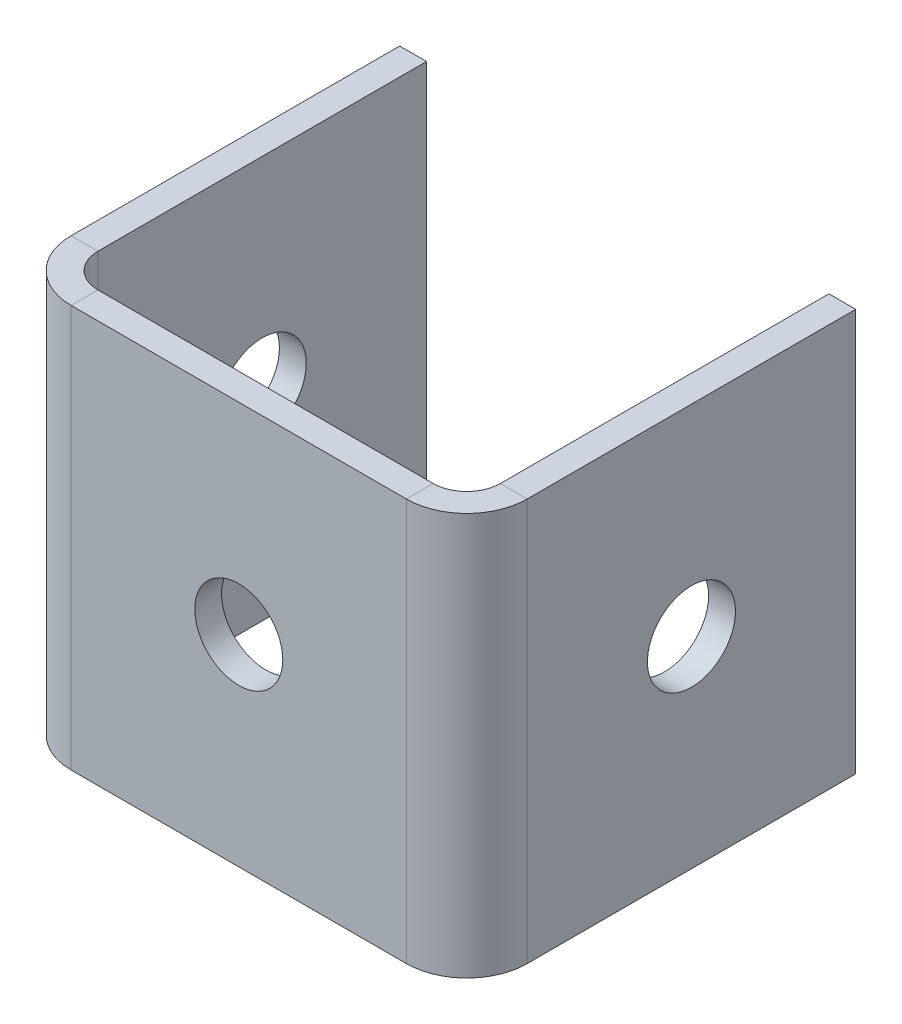
ISO-10303-21;
HEADER;
FILE_DESCRIPTION(('STEP AP214'),'2;1');
FILE_NAME('part.step','',(''),(''),'','','');
FILE_SCHEMA(('AUTOMOTIVE_DESIGN { 1 0 10303 214 1 1 1 1 }'));
ENDSEC;
DATA;
#1=APPLICATION_CONTEXT('core data for automotive mechanical design processes');
#2=APPLICATION_PROTOCOL_DEFINITION('international standard','automotive_design',2000,#1);
#3=PRODUCT_CONTEXT('',#1,'mechanical');
#4=PRODUCT('Part','Part','',(#3));
#5=PRODUCT_RELATED_PRODUCT_CATEGORY('part','',(#4));
#6=PRODUCT_DEFINITION_FORMATION('','',#4);
#7=PRODUCT_DEFINITION_CONTEXT('part definition',#1,'design');
#8=PRODUCT_DEFINITION('design','',#6,#7);
#9=PRODUCT_DEFINITION_SHAPE('','',#8);
#10=(LENGTH_UNIT() NAMED_UNIT(*) SI_UNIT(.MILLI.,.METRE.));
#11=(NAMED_UNIT(*) PLANE_ANGLE_UNIT() SI_UNIT($,.RADIAN.));
#12=(NAMED_UNIT(*) SI_UNIT($,.STERADIAN.) SOLID_ANGLE_UNIT());
#13=UNCERTAINTY_MEASURE_WITH_UNIT(LENGTH_MEASURE(1.E-05),#10,'distance_accuracy_value','');
#14=(GEOMETRIC_REPRESENTATION_CONTEXT(3) GLOBAL_UNCERTAINTY_ASSIGNED_CONTEXT((#13)) GLOBAL_UNIT_ASSIGNED_CONTEXT((#10,
#11,#12)) REPRESENTATION_CONTEXT('',''));
#15=CARTESIAN_POINT('',(0.,0.,0.));
#16=DIRECTION('',(0.,0.,1.));
#17=DIRECTION('',(1.,0.,0.));
#18=AXIS2_PLACEMENT_3D('',#15,#16,#17);
#19=CARTESIAN_POINT('',(-15.875,-19.05,-2.54));
#20=DIRECTION('',(0.,-1.,0.));
#21=DIRECTION('',(0.,0.,-1.));
#22=AXIS2_PLACEMENT_3D('',#19,#20,#21);
#23=PLANE('',#22);
#24=DIRECTION('',(1.,0.,0.));
#25=VECTOR('',#24,1.);
#26=CARTESIAN_POINT('',(-15.875,-19.05,0.));
#27=LINE('',#26,#25);
#28=CARTESIAN_POINT('',(-15.875,-19.05,0.));
#29=VERTEX_POINT('',#28);
#30=CARTESIAN_POINT('',(15.875,-19.05,0.));
#31=VERTEX_POINT('',#30);
#32=EDGE_CURVE('E269',#29,#31,#27,.T.);
#33=ORIENTED_EDGE('',*,*,#32,.F.);
#34=DIRECTION('',(0.,0.,1.));
#35=VECTOR('',#34,1.);
#36=CARTESIAN_POINT('',(-15.875,-19.05,-2.54));
#37=LINE('',#36,#35);
#38=CARTESIAN_POINT('',(-15.875,-19.05,-2.54000000000001));
#39=VERTEX_POINT('',#38);
#40=EDGE_CURVE('E90',#39,#29,#37,.T.);
#41=ORIENTED_EDGE('',*,*,#40,.F.);
#42=DIRECTION('',(1.,0.,0.));
#43=VECTOR('',#42,1.);
#44=CARTESIAN_POINT('',(-15.875,-19.05,-2.54));
#45=LINE('',#44,#43);
#46=CARTESIAN_POINT('',(15.875,-19.05,-2.54000000000001));
#47=VERTEX_POINT('',#46);
#48=EDGE_CURVE('E274',#39,#47,#45,.T.);
#49=ORIENTED_EDGE('',*,*,#48,.T.);
#50=DIRECTION('',(0.,0.,1.));
#51=VECTOR('',#50,1.);
#52=CARTESIAN_POINT('',(15.875,-19.05,-2.54));
#53=LINE('',#52,#51);
#54=EDGE_CURVE('E13',#47,#31,#53,.T.);
#55=ORIENTED_EDGE('',*,*,#54,.T.);
#56=EDGE_LOOP('',(#33,#41,#49,#55));
#57=FACE_BOUND('',#56,.T.);
#58=ADVANCED_FACE('F81',(#57),#23,.T.);
#59=CARTESIAN_POINT('',(-15.875,19.05,-2.54));
#60=DIRECTION('',(0.,1.,0.));
#61=DIRECTION('',(0.,0.,1.));
#62=AXIS2_PLACEMENT_3D('',#59,#60,#61);
#63=PLANE('',#62);
#64=DIRECTION('',(-1.,0.,0.));
#65=VECTOR('',#64,1.);
#66=CARTESIAN_POINT('',(-15.875,19.05,0.));
#67=LINE('',#66,#65);
#68=CARTESIAN_POINT('',(15.875,19.05,0.));
#69=VERTEX_POINT('',#68);
#70=CARTESIAN_POINT('',(-15.875,19.05,0.));
#71=VERTEX_POINT('',#70);
#72=EDGE_CURVE('E279',#69,#71,#67,.T.);
#73=ORIENTED_EDGE('',*,*,#72,.F.);
#74=DIRECTION('',(0.,0.,1.));
#75=VECTOR('',#74,1.);
#76=CARTESIAN_POINT('',(15.875,19.05,-2.54));
#77=LINE('',#76,#75);
#78=CARTESIAN_POINT('',(15.875,19.05,-2.54000000000001));
#79=VERTEX_POINT('',#78);
#80=EDGE_CURVE('E85',#79,#69,#77,.T.);
#81=ORIENTED_EDGE('',*,*,#80,.F.);
#82=DIRECTION('',(-1.,0.,0.));
#83=VECTOR('',#82,1.);
#84=CARTESIAN_POINT('',(-15.875,19.05,-2.54));
#85=LINE('',#84,#83);
#86=CARTESIAN_POINT('',(-15.875,19.05,-2.54000000000001));
#87=VERTEX_POINT('',#86);
#88=EDGE_CURVE('E268',#79,#87,#85,.T.);
#89=ORIENTED_EDGE('',*,*,#88,.T.);
#90=DIRECTION('',(0.,0.,1.));
#91=VECTOR('',#90,1.);
#92=CARTESIAN_POINT('',(-15.875,19.05,-2.54));
#93=LINE('',#92,#91);
#94=EDGE_CURVE('E287',#87,#71,#93,.T.);
#95=ORIENTED_EDGE('',*,*,#94,.T.);
#96=EDGE_LOOP('',(#73,#81,#89,#95));
#97=FACE_BOUND('',#96,.T.);
#98=ADVANCED_FACE('F83',(#97),#63,.T.);
#99=CARTESIAN_POINT('',(0.,0.,-2.54));
#100=DIRECTION('',(0.,0.,1.));
#101=DIRECTION('',(1.,0.,0.));
#102=AXIS2_PLACEMENT_3D('',#99,#100,#101);
#103=PLANE('',#102);
#104=CARTESIAN_POINT('',(0.,0.,-2.54));
#105=DIRECTION('',(0.,0.,1.));
#106=DIRECTION('',(1.,0.,0.));
#107=AXIS2_PLACEMENT_3D('',#104,#105,#106);
#108=CIRCLE('',#107,4.16725099999999);
#109=CARTESIAN_POINT('',(4.16725099999999,0.,-2.54));
#110=VERTEX_POINT('',#109);
#111=EDGE_CURVE('E214',#110,#110,#108,.T.);
#112=ORIENTED_EDGE('',*,*,#111,.T.);
#113=EDGE_LOOP('',(#112));
#114=FACE_BOUND('',#113,.T.);
#115=DIRECTION('',(0.,1.,0.));
#116=VECTOR('',#115,1.);
#117=CARTESIAN_POINT('',(15.875,19.05,-2.54));
#118=LINE('',#117,#116);
#119=EDGE_CURVE('E266',#47,#79,#118,.T.);
#120=ORIENTED_EDGE('',*,*,#119,.F.);
#121=ORIENTED_EDGE('',*,*,#48,.F.);
#122=DIRECTION('',(0.,-1.,0.));
#123=VECTOR('',#122,1.);
#124=CARTESIAN_POINT('',(-15.875,19.05,-2.54));
#125=LINE('',#124,#123);
#126=EDGE_CURVE('E272',#87,#39,#125,.T.);
#127=ORIENTED_EDGE('',*,*,#126,.F.);
#128=ORIENTED_EDGE('',*,*,#88,.F.);
#129=EDGE_LOOP('',(#120,#121,#127,#128));
#130=FACE_BOUND('',#129,.T.);
#131=ADVANCED_FACE('F311',(#114,#130),#103,.F.);
#132=CARTESIAN_POINT('',(0.,0.,0.));
#133=DIRECTION('',(0.,0.,1.));
#134=DIRECTION('',(1.,0.,0.));
#135=AXIS2_PLACEMENT_3D('',#132,#133,#134);
#136=PLANE('',#135);
#137=CARTESIAN_POINT('',(0.,0.,0.));
#138=DIRECTION('',(0.,0.,1.));
#139=DIRECTION('',(1.,0.,0.));
#140=AXIS2_PLACEMENT_3D('',#137,#138,#139);
#141=CIRCLE('',#140,4.167251);
#142=CARTESIAN_POINT('',(4.167251,0.,0.));
#143=VERTEX_POINT('',#142);
#144=EDGE_CURVE('E429',#143,#143,#141,.T.);
#145=ORIENTED_EDGE('',*,*,#144,.F.);
#146=EDGE_LOOP('',(#145));
#147=FACE_BOUND('',#146,.T.);
#148=DIRECTION('',(0.,1.,0.));
#149=VECTOR('',#148,1.);
#150=CARTESIAN_POINT('',(15.875,19.05,0.));
#151=LINE('',#150,#149);
#152=EDGE_CURVE('E257',#31,#69,#151,.T.);
#153=ORIENTED_EDGE('',*,*,#152,.T.);
#154=ORIENTED_EDGE('',*,*,#72,.T.);
#155=DIRECTION('',(0.,-1.,0.));
#156=VECTOR('',#155,1.);
#157=CARTESIAN_POINT('',(-15.875,19.05,0.));
#158=LINE('',#157,#156);
#159=EDGE_CURVE('E282',#71,#29,#158,.T.);
#160=ORIENTED_EDGE('',*,*,#159,.T.);
#161=ORIENTED_EDGE('',*,*,#32,.T.);
#162=EDGE_LOOP('',(#153,#154,#160,#161));
#163=FACE_BOUND('',#162,.T.);
#164=ADVANCED_FACE('F297',(#147,#163),#136,.T.);
#165=CARTESIAN_POINT('',(15.875,19.05,-5.715));
#166=DIRECTION('',(0.,1.,0.));
#167=DIRECTION('',(0.,0.,1.));
#168=AXIS2_PLACEMENT_3D('',#165,#166,#167);
#169=PLANE('',#168);
#170=DIRECTION('',(-1.,0.,0.));
#171=VECTOR('',#170,1.);
#172=CARTESIAN_POINT('',(21.59,19.05,-5.71499999999998));
#173=LINE('',#172,#171);
#174=CARTESIAN_POINT('',(19.05,19.05,-5.71499999999999));
#175=VERTEX_POINT('',#174);
#176=CARTESIAN_POINT('',(21.59,19.05,-5.71499999999998));
#177=VERTEX_POINT('',#176);
#178=EDGE_CURVE('E216',#175,#177,#173,.F.);
#179=ORIENTED_EDGE('',*,*,#178,.F.);
#180=CARTESIAN_POINT('',(15.875,19.05,-5.715));
#181=DIRECTION('',(0.,-1.,0.));
#182=DIRECTION('',(0.,0.,-1.));
#183=AXIS2_PLACEMENT_3D('',#180,#181,#182);
#184=CIRCLE('',#183,3.17499999999999);
#185=EDGE_CURVE('E261',#79,#175,#184,.F.);
#186=ORIENTED_EDGE('',*,*,#185,.F.);
#187=ORIENTED_EDGE('',*,*,#80,.T.);
#188=CARTESIAN_POINT('',(15.875,19.05,-5.715));
#189=DIRECTION('',(0.,-1.,0.));
#190=DIRECTION('',(0.,0.,-1.));
#191=AXIS2_PLACEMENT_3D('',#188,#189,#190);
#192=CIRCLE('',#191,5.71499999999999);
#193=EDGE_CURVE('E106',#69,#177,#192,.F.);
#194=ORIENTED_EDGE('',*,*,#193,.T.);
#195=EDGE_LOOP('',(#179,#186,#187,#194));
#196=FACE_BOUND('',#195,.T.);
#197=ADVANCED_FACE('F294',(#196),#169,.T.);
#198=CARTESIAN_POINT('',(15.875,-19.05,-5.715));
#199=DIRECTION('',(0.,1.,0.));
#200=DIRECTION('',(0.,0.,1.));
#201=AXIS2_PLACEMENT_3D('',#198,#199,#200);
#202=PLANE('',#201);
#203=CARTESIAN_POINT('',(15.875,-19.05,-5.715));
#204=DIRECTION('',(0.,-1.,0.));
#205=DIRECTION('',(0.,0.,-1.));
#206=AXIS2_PLACEMENT_3D('',#203,#204,#205);
#207=CIRCLE('',#206,3.17499999999999);
#208=CARTESIAN_POINT('',(19.05,-19.05,-5.71499999999999));
#209=VERTEX_POINT('',#208);
#210=EDGE_CURVE('E229',#209,#47,#207,.T.);
#211=ORIENTED_EDGE('',*,*,#210,.F.);
#212=DIRECTION('',(-1.,0.,0.));
#213=VECTOR('',#212,1.);
#214=CARTESIAN_POINT('',(19.05,-19.05,-5.71499999999999));
#215=LINE('',#214,#213);
#216=CARTESIAN_POINT('',(21.59,-19.05,-5.71499999999998));
#217=VERTEX_POINT('',#216);
#218=EDGE_CURVE('E249',#209,#217,#215,.F.);
#219=ORIENTED_EDGE('',*,*,#218,.T.);
#220=CARTESIAN_POINT('',(15.875,-19.05,-5.715));
#221=DIRECTION('',(0.,-1.,0.));
#222=DIRECTION('',(0.,0.,-1.));
#223=AXIS2_PLACEMENT_3D('',#220,#221,#222);
#224=CIRCLE('',#223,5.71499999999999);
#225=EDGE_CURVE('E258',#217,#31,#224,.T.);
#226=ORIENTED_EDGE('',*,*,#225,.T.);
#227=ORIENTED_EDGE('',*,*,#54,.F.);
#228=EDGE_LOOP('',(#211,#219,#226,#227));
#229=FACE_BOUND('',#228,.T.);
#230=ADVANCED_FACE('F302',(#229),#202,.F.);
#231=CARTESIAN_POINT('',(15.875,-19.05,-5.715));
#232=DIRECTION('',(0.,-1.,0.));
#233=DIRECTION('',(1.,0.,0.));
#234=AXIS2_PLACEMENT_3D('',#231,#232,#233);
#235=CYLINDRICAL_SURFACE('',#234,5.71499999999999);
#236=ORIENTED_EDGE('',*,*,#152,.F.);
#237=ORIENTED_EDGE('',*,*,#225,.F.);
#238=DIRECTION('',(0.,-1.,0.));
#239=VECTOR('',#238,1.);
#240=CARTESIAN_POINT('',(21.59,19.05,-5.71499999999998));
#241=LINE('',#240,#239);
#242=EDGE_CURVE('E247',#217,#177,#241,.F.);
#243=ORIENTED_EDGE('',*,*,#242,.T.);
#244=ORIENTED_EDGE('',*,*,#193,.F.);
#245=EDGE_LOOP('',(#236,#237,#243,#244));
#246=FACE_BOUND('',#245,.T.);
#247=ADVANCED_FACE('F299',(#246),#235,.T.);
#248=CARTESIAN_POINT('',(15.875,-19.05,-5.715));
#249=DIRECTION('',(0.,-1.,0.));
#250=DIRECTION('',(1.,0.,0.));
#251=AXIS2_PLACEMENT_3D('',#248,#249,#250);
#252=CYLINDRICAL_SURFACE('',#251,3.17499999999999);
#253=ORIENTED_EDGE('',*,*,#119,.T.);
#254=ORIENTED_EDGE('',*,*,#185,.T.);
#255=DIRECTION('',(0.,-1.,0.));
#256=VECTOR('',#255,1.);
#257=CARTESIAN_POINT('',(19.05,19.05,-5.71499999999999));
#258=LINE('',#257,#256);
#259=EDGE_CURVE('E252',#175,#209,#258,.T.);
#260=ORIENTED_EDGE('',*,*,#259,.T.);
#261=ORIENTED_EDGE('',*,*,#210,.T.);
#262=EDGE_LOOP('',(#253,#254,#260,#261));
#263=FACE_BOUND('',#262,.T.);
#264=ADVANCED_FACE('F313',(#263),#252,.F.);
#265=CARTESIAN_POINT('',(21.5900000000001,-19.05,-36.83));
#266=DIRECTION('',(0.,1.,0.));
#267=DIRECTION('',(-1.,0.,0.));
#268=AXIS2_PLACEMENT_3D('',#265,#266,#267);
#269=PLANE('',#268);
#270=ORIENTED_EDGE('',*,*,#218,.F.);
#271=DIRECTION('',(0.,0.,1.));
#272=VECTOR('',#271,1.);
#273=CARTESIAN_POINT('',(19.0500000000001,-19.05,-36.83));
#274=LINE('',#273,#272);
#275=CARTESIAN_POINT('',(19.0500000000001,-19.05,-36.83));
#276=VERTEX_POINT('',#275);
#277=EDGE_CURVE('E245',#209,#276,#274,.F.);
#278=ORIENTED_EDGE('',*,*,#277,.T.);
#279=DIRECTION('',(-1.,0.,0.));
#280=VECTOR('',#279,1.);
#281=CARTESIAN_POINT('',(21.5900000000001,-19.05,-36.83));
#282=LINE('',#281,#280);
#283=CARTESIAN_POINT('',(21.5900000000001,-19.05,-36.83));
#284=VERTEX_POINT('',#283);
#285=EDGE_CURVE('E226',#284,#276,#282,.T.);
#286=ORIENTED_EDGE('',*,*,#285,.F.);
#287=DIRECTION('',(0.,0.,-1.));
#288=VECTOR('',#287,1.);
#289=CARTESIAN_POINT('',(21.59,-19.05,0.));
#290=LINE('',#289,#288);
#291=EDGE_CURVE('E238',#217,#284,#290,.T.);
#292=ORIENTED_EDGE('',*,*,#291,.F.);
#293=EDGE_LOOP('',(#270,#278,#286,#292));
#294=FACE_BOUND('',#293,.T.);
#295=ADVANCED_FACE('F318',(#294),#269,.F.);
#296=CARTESIAN_POINT('',(21.59,19.05,-2.53999999999999));
#297=DIRECTION('',(0.,-1.,0.));
#298=DIRECTION('',(1.,0.,0.));
#299=AXIS2_PLACEMENT_3D('',#296,#297,#298);
#300=PLANE('',#299);
#301=ORIENTED_EDGE('',*,*,#178,.T.);
#302=DIRECTION('',(0.,0.,1.));
#303=VECTOR('',#302,1.);
#304=CARTESIAN_POINT('',(21.59,19.05,0.));
#305=LINE('',#304,#303);
#306=CARTESIAN_POINT('',(21.5900000000001,19.05,-36.83));
#307=VERTEX_POINT('',#306);
#308=EDGE_CURVE('E233',#307,#177,#305,.T.);
#309=ORIENTED_EDGE('',*,*,#308,.F.);
#310=DIRECTION('',(-1.,0.,0.));
#311=VECTOR('',#310,1.);
#312=CARTESIAN_POINT('',(21.5900000000001,19.05,-36.83));
#313=LINE('',#312,#311);
#314=CARTESIAN_POINT('',(19.0500000000001,19.05,-36.83));
#315=VERTEX_POINT('',#314);
#316=EDGE_CURVE('E230',#307,#315,#313,.T.);
#317=ORIENTED_EDGE('',*,*,#316,.T.);
#318=DIRECTION('',(0.,0.,-1.));
#319=VECTOR('',#318,1.);
#320=CARTESIAN_POINT('',(19.05,19.05,-2.54));
#321=LINE('',#320,#319);
#322=EDGE_CURVE('E240',#315,#175,#321,.F.);
#323=ORIENTED_EDGE('',*,*,#322,.T.);
#324=EDGE_LOOP('',(#301,#309,#317,#323));
#325=FACE_BOUND('',#324,.T.);
#326=ADVANCED_FACE('F330',(#325),#300,.F.);
#327=CARTESIAN_POINT('',(21.59,0.,0.));
#328=DIRECTION('',(-1.,0.,0.));
#329=DIRECTION('',(0.,0.,1.));
#330=AXIS2_PLACEMENT_3D('',#327,#328,#329);
#331=PLANE('',#330);
#332=CARTESIAN_POINT('',(21.5900000000001,0.,-21.2725));
#333=DIRECTION('',(1.,0.,0.));
#334=DIRECTION('',(0.,0.,-1.));
#335=AXIS2_PLACEMENT_3D('',#332,#333,#334);
#336=CIRCLE('',#335,4.16725099999999);
#337=CARTESIAN_POINT('',(21.5900000000001,0.,-25.439751));
#338=VERTEX_POINT('',#337);
#339=EDGE_CURVE('E420',#338,#338,#336,.T.);
#340=ORIENTED_EDGE('',*,*,#339,.F.);
#341=EDGE_LOOP('',(#340));
#342=FACE_BOUND('',#341,.T.);
#343=ORIENTED_EDGE('',*,*,#242,.F.);
#344=ORIENTED_EDGE('',*,*,#291,.T.);
#345=DIRECTION('',(0.,1.,0.));
#346=VECTOR('',#345,1.);
#347=CARTESIAN_POINT('',(21.5900000000001,0.,-36.83));
#348=LINE('',#347,#346);
#349=EDGE_CURVE('E236',#284,#307,#348,.T.);
#350=ORIENTED_EDGE('',*,*,#349,.T.);
#351=ORIENTED_EDGE('',*,*,#308,.T.);
#352=EDGE_LOOP('',(#343,#344,#350,#351));
#353=FACE_BOUND('',#352,.T.);
#354=ADVANCED_FACE('F332',(#342,#353),#331,.F.);
#355=CARTESIAN_POINT('',(19.05,0.,0.));
#356=DIRECTION('',(-1.,0.,0.));
#357=DIRECTION('',(0.,0.,1.));
#358=AXIS2_PLACEMENT_3D('',#355,#356,#357);
#359=PLANE('',#358);
#360=CARTESIAN_POINT('',(19.0500000000001,0.,-21.2725));
#361=DIRECTION('',(-1.,0.,0.));
#362=DIRECTION('',(0.,0.,1.));
#363=AXIS2_PLACEMENT_3D('',#360,#361,#362);
#364=CIRCLE('',#363,4.16725099999999);
#365=CARTESIAN_POINT('',(19.05,0.,-17.105249));
#366=VERTEX_POINT('',#365);
#367=EDGE_CURVE('E422',#366,#366,#364,.T.);
#368=ORIENTED_EDGE('',*,*,#367,.F.);
#369=EDGE_LOOP('',(#368));
#370=FACE_BOUND('',#369,.T.);
#371=ORIENTED_EDGE('',*,*,#277,.F.);
#372=ORIENTED_EDGE('',*,*,#259,.F.);
#373=ORIENTED_EDGE('',*,*,#322,.F.);
#374=DIRECTION('',(0.,-1.,0.));
#375=VECTOR('',#374,1.);
#376=CARTESIAN_POINT('',(19.0500000000001,19.05,-36.83));
#377=LINE('',#376,#375);
#378=EDGE_CURVE('E243',#276,#315,#377,.F.);
#379=ORIENTED_EDGE('',*,*,#378,.F.);
#380=EDGE_LOOP('',(#371,#372,#373,#379));
#381=FACE_BOUND('',#380,.T.);
#382=ADVANCED_FACE('F322',(#370,#381),#359,.T.);
#383=CARTESIAN_POINT('',(21.5900000000001,19.05,-36.83));
#384=DIRECTION('',(0.,0.,1.));
#385=DIRECTION('',(1.,0.,0.));
#386=AXIS2_PLACEMENT_3D('',#383,#384,#385);
#387=PLANE('',#386);
#388=ORIENTED_EDGE('',*,*,#378,.T.);
#389=ORIENTED_EDGE('',*,*,#316,.F.);
#390=ORIENTED_EDGE('',*,*,#349,.F.);
#391=ORIENTED_EDGE('',*,*,#285,.T.);
#392=EDGE_LOOP('',(#388,#389,#390,#391));
#393=FACE_BOUND('',#392,.T.);
#394=ADVANCED_FACE('F326',(#393),#387,.F.);
#395=CARTESIAN_POINT('',(-15.875,-19.05,-5.715));
#396=DIRECTION('',(0.,-1.,0.));
#397=DIRECTION('',(0.,0.,-1.));
#398=AXIS2_PLACEMENT_3D('',#395,#396,#397);
#399=PLANE('',#398);
#400=DIRECTION('',(1.,0.,0.));
#401=VECTOR('',#400,1.);
#402=CARTESIAN_POINT('',(-21.59,-19.05,-5.71499999999998));
#403=LINE('',#402,#401);
#404=CARTESIAN_POINT('',(-19.05,-19.05,-5.71499999999999));
#405=VERTEX_POINT('',#404);
#406=CARTESIAN_POINT('',(-21.59,-19.05,-5.71499999999998));
#407=VERTEX_POINT('',#406);
#408=EDGE_CURVE('E196',#405,#407,#403,.F.);
#409=ORIENTED_EDGE('',*,*,#408,.F.);
#410=CARTESIAN_POINT('',(-15.875,-19.05,-5.715));
#411=DIRECTION('',(0.,1.,0.));
#412=DIRECTION('',(0.,0.,1.));
#413=AXIS2_PLACEMENT_3D('',#410,#411,#412);
#414=CIRCLE('',#413,3.17499999999999);
#415=EDGE_CURVE('E220',#39,#405,#414,.F.);
#416=ORIENTED_EDGE('',*,*,#415,.F.);
#417=ORIENTED_EDGE('',*,*,#40,.T.);
#418=CARTESIAN_POINT('',(-15.875,-19.05,-5.715));
#419=DIRECTION('',(0.,1.,0.));
#420=DIRECTION('',(0.,0.,1.));
#421=AXIS2_PLACEMENT_3D('',#418,#419,#420);
#422=CIRCLE('',#421,5.71499999999999);
#423=EDGE_CURVE('E98',#29,#407,#422,.F.);
#424=ORIENTED_EDGE('',*,*,#423,.T.);
#425=EDGE_LOOP('',(#409,#416,#417,#424));
#426=FACE_BOUND('',#425,.T.);
#427=ADVANCED_FACE('F367',(#426),#399,.T.);
#428=CARTESIAN_POINT('',(-15.875,19.05,-5.715));
#429=DIRECTION('',(0.,-1.,0.));
#430=DIRECTION('',(0.,0.,-1.));
#431=AXIS2_PLACEMENT_3D('',#428,#429,#430);
#432=PLANE('',#431);
#433=CARTESIAN_POINT('',(-15.875,19.05,-5.715));
#434=DIRECTION('',(0.,1.,0.));
#435=DIRECTION('',(0.,0.,1.));
#436=AXIS2_PLACEMENT_3D('',#433,#434,#435);
#437=CIRCLE('',#436,3.17499999999999);
#438=CARTESIAN_POINT('',(-19.05,19.05,-5.71499999999999));
#439=VERTEX_POINT('',#438);
#440=EDGE_CURVE('E223',#439,#87,#437,.T.);
#441=ORIENTED_EDGE('',*,*,#440,.F.);
#442=DIRECTION('',(1.,0.,0.));
#443=VECTOR('',#442,1.);
#444=CARTESIAN_POINT('',(-19.05,19.05,-5.71499999999999));
#445=LINE('',#444,#443);
#446=CARTESIAN_POINT('',(-21.59,19.05,-5.71499999999998));
#447=VERTEX_POINT('',#446);
#448=EDGE_CURVE('E208',#439,#447,#445,.F.);
#449=ORIENTED_EDGE('',*,*,#448,.T.);
#450=CARTESIAN_POINT('',(-15.875,19.05,-5.715));
#451=DIRECTION('',(0.,1.,0.));
#452=DIRECTION('',(0.,0.,1.));
#453=AXIS2_PLACEMENT_3D('',#450,#451,#452);
#454=CIRCLE('',#453,5.71499999999999);
#455=EDGE_CURVE('E217',#447,#71,#454,.T.);
#456=ORIENTED_EDGE('',*,*,#455,.T.);
#457=ORIENTED_EDGE('',*,*,#94,.F.);
#458=EDGE_LOOP('',(#441,#449,#456,#457));
#459=FACE_BOUND('',#458,.T.);
#460=ADVANCED_FACE('F371',(#459),#432,.F.);
#461=CARTESIAN_POINT('',(-15.875,19.05,-5.715));
#462=DIRECTION('',(0.,1.,0.));
#463=DIRECTION('',(-1.,0.,0.));
#464=AXIS2_PLACEMENT_3D('',#461,#462,#463);
#465=CYLINDRICAL_SURFACE('',#464,5.71499999999999);
#466=ORIENTED_EDGE('',*,*,#159,.F.);
#467=ORIENTED_EDGE('',*,*,#455,.F.);
#468=DIRECTION('',(0.,1.,0.));
#469=VECTOR('',#468,1.);
#470=CARTESIAN_POINT('',(-21.59,-19.05,-5.71499999999998));
#471=LINE('',#470,#469);
#472=EDGE_CURVE('E206',#447,#407,#471,.F.);
#473=ORIENTED_EDGE('',*,*,#472,.T.);
#474=ORIENTED_EDGE('',*,*,#423,.F.);
#475=EDGE_LOOP('',(#466,#467,#473,#474));
#476=FACE_BOUND('',#475,.T.);
#477=ADVANCED_FACE('F377',(#476),#465,.T.);
#478=CARTESIAN_POINT('',(-15.875,19.05,-5.715));
#479=DIRECTION('',(0.,1.,0.));
#480=DIRECTION('',(-1.,0.,0.));
#481=AXIS2_PLACEMENT_3D('',#478,#479,#480);
#482=CYLINDRICAL_SURFACE('',#481,3.17499999999999);
#483=ORIENTED_EDGE('',*,*,#126,.T.);
#484=ORIENTED_EDGE('',*,*,#415,.T.);
#485=DIRECTION('',(0.,1.,0.));
#486=VECTOR('',#485,1.);
#487=CARTESIAN_POINT('',(-19.05,-19.05,-5.71499999999999));
#488=LINE('',#487,#486);
#489=EDGE_CURVE('E211',#405,#439,#488,.T.);
#490=ORIENTED_EDGE('',*,*,#489,.T.);
#491=ORIENTED_EDGE('',*,*,#440,.T.);
#492=EDGE_LOOP('',(#483,#484,#490,#491));
#493=FACE_BOUND('',#492,.T.);
#494=ADVANCED_FACE('F380',(#493),#482,.F.);
#495=CARTESIAN_POINT('',(-21.5900000000001,19.05,-36.83));
#496=DIRECTION('',(0.,-1.,0.));
#497=DIRECTION('',(0.,0.,-1.));
#498=AXIS2_PLACEMENT_3D('',#495,#496,#497);
#499=PLANE('',#498);
#500=ORIENTED_EDGE('',*,*,#448,.F.);
#501=DIRECTION('',(0.,0.,1.));
#502=VECTOR('',#501,1.);
#503=CARTESIAN_POINT('',(-19.0500000000001,19.05,-36.83));
#504=LINE('',#503,#502);
#505=CARTESIAN_POINT('',(-19.0500000000001,19.05,-36.83));
#506=VERTEX_POINT('',#505);
#507=EDGE_CURVE('E204',#439,#506,#504,.F.);
#508=ORIENTED_EDGE('',*,*,#507,.T.);
#509=DIRECTION('',(1.,0.,0.));
#510=VECTOR('',#509,1.);
#511=CARTESIAN_POINT('',(-21.5900000000001,19.05,-36.83));
#512=LINE('',#511,#510);
#513=CARTESIAN_POINT('',(-21.5900000000001,19.05,-36.83));
#514=VERTEX_POINT('',#513);
#515=EDGE_CURVE('E192',#514,#506,#512,.T.);
#516=ORIENTED_EDGE('',*,*,#515,.F.);
#517=DIRECTION('',(0.,0.,-1.));
#518=VECTOR('',#517,1.);
#519=CARTESIAN_POINT('',(-21.59,19.05,0.));
#520=LINE('',#519,#518);
#521=EDGE_CURVE('E179',#447,#514,#520,.T.);
#522=ORIENTED_EDGE('',*,*,#521,.F.);
#523=EDGE_LOOP('',(#500,#508,#516,#522));
#524=FACE_BOUND('',#523,.T.);
#525=ADVANCED_FACE('F383',(#524),#499,.F.);
#526=CARTESIAN_POINT('',(-21.59,-19.05,-2.53999999999999));
#527=DIRECTION('',(0.,1.,0.));
#528=DIRECTION('',(0.,0.,1.));
#529=AXIS2_PLACEMENT_3D('',#526,#527,#528);
#530=PLANE('',#529);
#531=ORIENTED_EDGE('',*,*,#408,.T.);
#532=DIRECTION('',(0.,0.,1.));
#533=VECTOR('',#532,1.);
#534=CARTESIAN_POINT('',(-21.59,-19.05,0.));
#535=LINE('',#534,#533);
#536=CARTESIAN_POINT('',(-21.5900000000001,-19.05,-36.83));
#537=VERTEX_POINT('',#536);
#538=EDGE_CURVE('E177',#537,#407,#535,.T.);
#539=ORIENTED_EDGE('',*,*,#538,.F.);
#540=DIRECTION('',(1.,0.,0.));
#541=VECTOR('',#540,1.);
#542=CARTESIAN_POINT('',(-21.5900000000001,-19.05,-36.83));
#543=LINE('',#542,#541);
#544=CARTESIAN_POINT('',(-19.0500000000001,-19.05,-36.83));
#545=VERTEX_POINT('',#544);
#546=EDGE_CURVE('E185',#537,#545,#543,.T.);
#547=ORIENTED_EDGE('',*,*,#546,.T.);
#548=DIRECTION('',(0.,0.,-1.));
#549=VECTOR('',#548,1.);
#550=CARTESIAN_POINT('',(-19.05,-19.05,-2.54));
#551=LINE('',#550,#549);
#552=EDGE_CURVE('E201',#545,#405,#551,.F.);
#553=ORIENTED_EDGE('',*,*,#552,.T.);
#554=EDGE_LOOP('',(#531,#539,#547,#553));
#555=FACE_BOUND('',#554,.T.);
#556=ADVANCED_FACE('F195',(#555),#530,.F.);
#557=CARTESIAN_POINT('',(-21.59,0.,0.));
#558=DIRECTION('',(1.,0.,0.));
#559=DIRECTION('',(0.,0.,-1.));
#560=AXIS2_PLACEMENT_3D('',#557,#558,#559);
#561=PLANE('',#560);
#562=CARTESIAN_POINT('',(-21.5900000000002,0.,-21.2725000000001));
#563=DIRECTION('',(1.,0.,0.));
#564=DIRECTION('',(0.,0.,-1.));
#565=AXIS2_PLACEMENT_3D('',#562,#563,#564);
#566=CIRCLE('',#565,4.16725099999999);
#567=CARTESIAN_POINT('',(-21.5900000000002,0.,-25.4397510000001));
#568=VERTEX_POINT('',#567);
#569=EDGE_CURVE('E419',#568,#568,#566,.T.);
#570=ORIENTED_EDGE('',*,*,#569,.T.);
#571=EDGE_LOOP('',(#570));
#572=FACE_BOUND('',#571,.T.);
#573=ORIENTED_EDGE('',*,*,#472,.F.);
#574=ORIENTED_EDGE('',*,*,#521,.T.);
#575=DIRECTION('',(0.,-1.,0.));
#576=VECTOR('',#575,1.);
#577=CARTESIAN_POINT('',(-21.5900000000001,0.,-36.83));
#578=LINE('',#577,#576);
#579=EDGE_CURVE('E172',#514,#537,#578,.T.);
#580=ORIENTED_EDGE('',*,*,#579,.T.);
#581=ORIENTED_EDGE('',*,*,#538,.T.);
#582=EDGE_LOOP('',(#573,#574,#580,#581));
#583=FACE_BOUND('',#582,.T.);
#584=ADVANCED_FACE('F175',(#572,#583),#561,.F.);
#585=CARTESIAN_POINT('',(-19.05,0.,0.));
#586=DIRECTION('',(1.,0.,0.));
#587=DIRECTION('',(0.,0.,-1.));
#588=AXIS2_PLACEMENT_3D('',#585,#586,#587);
#589=PLANE('',#588);
#590=CARTESIAN_POINT('',(-19.0500000000001,0.,-21.2725000000001));
#591=DIRECTION('',(1.,0.,0.));
#592=DIRECTION('',(0.,0.,-1.));
#593=AXIS2_PLACEMENT_3D('',#590,#591,#592);
#594=CIRCLE('',#593,4.16725099999999);
#595=CARTESIAN_POINT('',(-19.0500000000001,0.,-25.4397510000001));
#596=VERTEX_POINT('',#595);
#597=EDGE_CURVE('E416',#596,#596,#594,.T.);
#598=ORIENTED_EDGE('',*,*,#597,.F.);
#599=EDGE_LOOP('',(#598));
#600=FACE_BOUND('',#599,.T.);
#601=ORIENTED_EDGE('',*,*,#507,.F.);
#602=ORIENTED_EDGE('',*,*,#489,.F.);
#603=ORIENTED_EDGE('',*,*,#552,.F.);
#604=DIRECTION('',(0.,1.,0.));
#605=VECTOR('',#604,1.);
#606=CARTESIAN_POINT('',(-19.0500000000001,-19.05,-36.83));
#607=LINE('',#606,#605);
#608=EDGE_CURVE('E188',#506,#545,#607,.F.);
#609=ORIENTED_EDGE('',*,*,#608,.F.);
#610=EDGE_LOOP('',(#601,#602,#603,#609));
#611=FACE_BOUND('',#610,.T.);
#612=ADVANCED_FACE('F393',(#600,#611),#589,.T.);
#613=CARTESIAN_POINT('',(-21.5900000000001,-19.05,-36.83));
#614=DIRECTION('',(0.,0.,1.));
#615=DIRECTION('',(1.,0.,0.));
#616=AXIS2_PLACEMENT_3D('',#613,#614,#615);
#617=PLANE('',#616);
#618=ORIENTED_EDGE('',*,*,#608,.T.);
#619=ORIENTED_EDGE('',*,*,#546,.F.);
#620=ORIENTED_EDGE('',*,*,#579,.F.);
#621=ORIENTED_EDGE('',*,*,#515,.T.);
#622=EDGE_LOOP('',(#618,#619,#620,#621));
#623=FACE_BOUND('',#622,.T.);
#624=ADVANCED_FACE('F186',(#623),#617,.F.);
#625=CARTESIAN_POINT('',(0.,0.,0.));
#626=DIRECTION('',(0.,0.,1.));
#627=DIRECTION('',(1.,0.,0.));
#628=AXIS2_PLACEMENT_3D('',#625,#626,#627);
#629=CYLINDRICAL_SURFACE('',#628,4.16725099999999);
#630=ORIENTED_EDGE('',*,*,#144,.T.);
#631=EDGE_LOOP('',(#630));
#632=FACE_BOUND('',#631,.T.);
#633=ORIENTED_EDGE('',*,*,#111,.F.);
#634=EDGE_LOOP('',(#633));
#635=FACE_BOUND('',#634,.T.);
#636=ADVANCED_FACE('F392',(#632,#635),#629,.F.);
#637=CARTESIAN_POINT('',(21.5900000000001,0.,-21.2725));
#638=DIRECTION('',(1.,0.,0.));
#639=DIRECTION('',(0.,0.,-1.));
#640=AXIS2_PLACEMENT_3D('',#637,#638,#639);
#641=CYLINDRICAL_SURFACE('',#640,4.16725099999999);
#642=ORIENTED_EDGE('',*,*,#597,.T.);
#643=EDGE_LOOP('',(#642));
#644=FACE_BOUND('',#643,.T.);
#645=ORIENTED_EDGE('',*,*,#569,.F.);
#646=EDGE_LOOP('',(#645));
#647=FACE_BOUND('',#646,.T.);
#648=ADVANCED_FACE('F404',(#644,#647),#641,.F.);
#649=ORIENTED_EDGE('',*,*,#367,.T.);
#650=EDGE_LOOP('',(#649));
#651=FACE_BOUND('',#650,.T.);
#652=ORIENTED_EDGE('',*,*,#339,.T.);
#653=EDGE_LOOP('',(#652));
#654=FACE_BOUND('',#653,.T.);
#655=ADVANCED_FACE('F407',(#651,#654),#641,.F.);
#656=CLOSED_SHELL('',(#58,#98,#131,#164,#197,#230,#247,#264,#295,#326,#354,#382,#394,#427,#460,
#477,#494,#525,#556,#584,#612,#624,#636,#648,#655));
#657=MANIFOLD_SOLID_BREP('B2',#656);
#658=ADVANCED_BREP_SHAPE_REPRESENTATION('',(#18,#657),#14);
#659=SHAPE_DEFINITION_REPRESENTATION(#9,#658);
ENDSEC;
END-ISO-10303-21;
